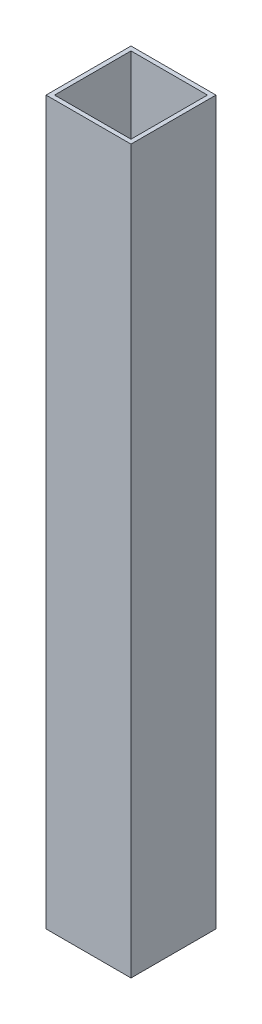
ISO-10303-21;
HEADER;
FILE_DESCRIPTION(('STEP AP214'),'2;1');
FILE_NAME('part.step','',(''),(''),'','','');
FILE_SCHEMA(('AUTOMOTIVE_DESIGN { 1 0 10303 214 1 1 1 1 }'));
ENDSEC;
DATA;
#1=APPLICATION_CONTEXT('core data for automotive mechanical design processes');
#2=APPLICATION_PROTOCOL_DEFINITION('international standard','automotive_design',2000,#1);
#3=PRODUCT_CONTEXT('',#1,'mechanical');
#4=PRODUCT('Part','Part','',(#3));
#5=PRODUCT_RELATED_PRODUCT_CATEGORY('part','',(#4));
#6=PRODUCT_DEFINITION_FORMATION('','',#4);
#7=PRODUCT_DEFINITION_CONTEXT('part definition',#1,'design');
#8=PRODUCT_DEFINITION('design','',#6,#7);
#9=PRODUCT_DEFINITION_SHAPE('','',#8);
#10=(LENGTH_UNIT() NAMED_UNIT(*) SI_UNIT(.MILLI.,.METRE.));
#11=(NAMED_UNIT(*) PLANE_ANGLE_UNIT() SI_UNIT($,.RADIAN.));
#12=(NAMED_UNIT(*) SI_UNIT($,.STERADIAN.) SOLID_ANGLE_UNIT());
#13=UNCERTAINTY_MEASURE_WITH_UNIT(LENGTH_MEASURE(1.E-05),#10,'distance_accuracy_value','');
#14=(GEOMETRIC_REPRESENTATION_CONTEXT(3) GLOBAL_UNCERTAINTY_ASSIGNED_CONTEXT((#13)) GLOBAL_UNIT_ASSIGNED_CONTEXT((#10,
#11,#12)) REPRESENTATION_CONTEXT('',''));
#15=CARTESIAN_POINT('',(0.,0.,0.));
#16=DIRECTION('',(0.,0.,1.));
#17=DIRECTION('',(1.,0.,0.));
#18=AXIS2_PLACEMENT_3D('',#15,#16,#17);
#19=CARTESIAN_POINT('',(0.,340.,0.));
#20=DIRECTION('',(0.,1.,0.));
#21=DIRECTION('',(0.,0.,1.));
#22=AXIS2_PLACEMENT_3D('',#19,#20,#21);
#23=PLANE('',#22);
#24=DIRECTION('',(0.,0.,-1.));
#25=VECTOR('',#24,1.);
#26=CARTESIAN_POINT('',(0.,340.,0.));
#27=LINE('',#26,#25);
#28=CARTESIAN_POINT('',(0.,340.,0.));
#29=VERTEX_POINT('',#28);
#30=CARTESIAN_POINT('',(0.,340.,-40.));
#31=VERTEX_POINT('',#30);
#32=EDGE_CURVE('E164',#29,#31,#27,.T.);
#33=ORIENTED_EDGE('',*,*,#32,.T.);
#34=DIRECTION('',(-1.,0.,0.));
#35=VECTOR('',#34,1.);
#36=CARTESIAN_POINT('',(0.,340.,-40.));
#37=LINE('',#36,#35);
#38=CARTESIAN_POINT('',(-40.,340.,-40.));
#39=VERTEX_POINT('',#38);
#40=EDGE_CURVE('E167',#31,#39,#37,.T.);
#41=ORIENTED_EDGE('',*,*,#40,.T.);
#42=DIRECTION('',(0.,0.,1.));
#43=VECTOR('',#42,1.);
#44=CARTESIAN_POINT('',(-40.,340.,0.));
#45=LINE('',#44,#43);
#46=CARTESIAN_POINT('',(-40.,340.,0.));
#47=VERTEX_POINT('',#46);
#48=EDGE_CURVE('E170',#39,#47,#45,.T.);
#49=ORIENTED_EDGE('',*,*,#48,.T.);
#50=DIRECTION('',(1.,0.,0.));
#51=VECTOR('',#50,1.);
#52=CARTESIAN_POINT('',(0.,340.,0.));
#53=LINE('',#52,#51);
#54=EDGE_CURVE('E172',#47,#29,#53,.T.);
#55=ORIENTED_EDGE('',*,*,#54,.T.);
#56=EDGE_LOOP('',(#33,#41,#49,#55));
#57=FACE_BOUND('',#56,.T.);
#58=DIRECTION('',(-1.,0.,0.));
#59=VECTOR('',#58,1.);
#60=CARTESIAN_POINT('',(0.,340.,-38.));
#61=LINE('',#60,#59);
#62=CARTESIAN_POINT('',(-2.,340.,-38.));
#63=VERTEX_POINT('',#62);
#64=CARTESIAN_POINT('',(-38.,340.,-38.));
#65=VERTEX_POINT('',#64);
#66=EDGE_CURVE('E136',#63,#65,#61,.T.);
#67=ORIENTED_EDGE('',*,*,#66,.F.);
#68=DIRECTION('',(0.,0.,-1.));
#69=VECTOR('',#68,1.);
#70=CARTESIAN_POINT('',(-2.,340.,0.));
#71=LINE('',#70,#69);
#72=CARTESIAN_POINT('',(-2.,340.,-2.));
#73=VERTEX_POINT('',#72);
#74=EDGE_CURVE('E128',#73,#63,#71,.T.);
#75=ORIENTED_EDGE('',*,*,#74,.F.);
#76=DIRECTION('',(1.,0.,0.));
#77=VECTOR('',#76,1.);
#78=CARTESIAN_POINT('',(0.,340.,-2.));
#79=LINE('',#78,#77);
#80=CARTESIAN_POINT('',(-38.,340.,-2.));
#81=VERTEX_POINT('',#80);
#82=EDGE_CURVE('E150',#81,#73,#79,.T.);
#83=ORIENTED_EDGE('',*,*,#82,.F.);
#84=DIRECTION('',(0.,0.,1.));
#85=VECTOR('',#84,1.);
#86=CARTESIAN_POINT('',(-38.,340.,0.));
#87=LINE('',#86,#85);
#88=EDGE_CURVE('E148',#65,#81,#87,.T.);
#89=ORIENTED_EDGE('',*,*,#88,.F.);
#90=EDGE_LOOP('',(#67,#75,#83,#89));
#91=FACE_BOUND('',#90,.T.);
#92=ADVANCED_FACE('F63',(#57,#91),#23,.T.);
#93=CARTESIAN_POINT('',(0.,0.,0.));
#94=DIRECTION('',(0.,1.,0.));
#95=DIRECTION('',(0.,0.,1.));
#96=AXIS2_PLACEMENT_3D('',#93,#94,#95);
#97=PLANE('',#96);
#98=DIRECTION('',(0.,0.,-1.));
#99=VECTOR('',#98,1.);
#100=CARTESIAN_POINT('',(0.,0.,0.));
#101=LINE('',#100,#99);
#102=CARTESIAN_POINT('',(0.,0.,0.));
#103=VERTEX_POINT('',#102);
#104=CARTESIAN_POINT('',(0.,0.,-40.));
#105=VERTEX_POINT('',#104);
#106=EDGE_CURVE('E144',#103,#105,#101,.T.);
#107=ORIENTED_EDGE('',*,*,#106,.F.);
#108=DIRECTION('',(1.,0.,0.));
#109=VECTOR('',#108,1.);
#110=CARTESIAN_POINT('',(0.,0.,0.));
#111=LINE('',#110,#109);
#112=CARTESIAN_POINT('',(-40.,0.,0.));
#113=VERTEX_POINT('',#112);
#114=EDGE_CURVE('E168',#113,#103,#111,.T.);
#115=ORIENTED_EDGE('',*,*,#114,.F.);
#116=DIRECTION('',(0.,0.,1.));
#117=VECTOR('',#116,1.);
#118=CARTESIAN_POINT('',(-40.,0.,0.));
#119=LINE('',#118,#117);
#120=CARTESIAN_POINT('',(-40.,0.,-40.));
#121=VERTEX_POINT('',#120);
#122=EDGE_CURVE('E179',#121,#113,#119,.T.);
#123=ORIENTED_EDGE('',*,*,#122,.F.);
#124=DIRECTION('',(-1.,0.,0.));
#125=VECTOR('',#124,1.);
#126=CARTESIAN_POINT('',(0.,0.,-40.));
#127=LINE('',#126,#125);
#128=EDGE_CURVE('E177',#105,#121,#127,.T.);
#129=ORIENTED_EDGE('',*,*,#128,.F.);
#130=EDGE_LOOP('',(#107,#115,#123,#129));
#131=FACE_BOUND('',#130,.T.);
#132=DIRECTION('',(0.,0.,-1.));
#133=VECTOR('',#132,1.);
#134=CARTESIAN_POINT('',(-2.,0.,0.));
#135=LINE('',#134,#133);
#136=CARTESIAN_POINT('',(-2.,0.,-2.));
#137=VERTEX_POINT('',#136);
#138=CARTESIAN_POINT('',(-2.,0.,-38.));
#139=VERTEX_POINT('',#138);
#140=EDGE_CURVE('E86',#137,#139,#135,.T.);
#141=ORIENTED_EDGE('',*,*,#140,.T.);
#142=DIRECTION('',(-1.,0.,0.));
#143=VECTOR('',#142,1.);
#144=CARTESIAN_POINT('',(0.,0.,-38.));
#145=LINE('',#144,#143);
#146=CARTESIAN_POINT('',(-38.,0.,-38.));
#147=VERTEX_POINT('',#146);
#148=EDGE_CURVE('E143',#139,#147,#145,.T.);
#149=ORIENTED_EDGE('',*,*,#148,.T.);
#150=DIRECTION('',(0.,0.,1.));
#151=VECTOR('',#150,1.);
#152=CARTESIAN_POINT('',(-38.,0.,0.));
#153=LINE('',#152,#151);
#154=CARTESIAN_POINT('',(-38.,0.,-2.));
#155=VERTEX_POINT('',#154);
#156=EDGE_CURVE('E156',#147,#155,#153,.T.);
#157=ORIENTED_EDGE('',*,*,#156,.T.);
#158=DIRECTION('',(1.,0.,0.));
#159=VECTOR('',#158,1.);
#160=CARTESIAN_POINT('',(0.,0.,-2.));
#161=LINE('',#160,#159);
#162=EDGE_CURVE('E137',#155,#137,#161,.T.);
#163=ORIENTED_EDGE('',*,*,#162,.T.);
#164=EDGE_LOOP('',(#141,#149,#157,#163));
#165=FACE_BOUND('',#164,.T.);
#166=ADVANCED_FACE('F197',(#131,#165),#97,.F.);
#167=CARTESIAN_POINT('',(0.,340.,0.));
#168=DIRECTION('',(-1.,0.,0.));
#169=DIRECTION('',(0.,0.,1.));
#170=AXIS2_PLACEMENT_3D('',#167,#168,#169);
#171=PLANE('',#170);
#172=ORIENTED_EDGE('',*,*,#106,.T.);
#173=DIRECTION('',(0.,-1.,0.));
#174=VECTOR('',#173,1.);
#175=CARTESIAN_POINT('',(0.,340.,-40.));
#176=LINE('',#175,#174);
#177=EDGE_CURVE('E12',#31,#105,#176,.T.);
#178=ORIENTED_EDGE('',*,*,#177,.F.);
#179=ORIENTED_EDGE('',*,*,#32,.F.);
#180=DIRECTION('',(0.,-1.,0.));
#181=VECTOR('',#180,1.);
#182=CARTESIAN_POINT('',(0.,340.,0.));
#183=LINE('',#182,#181);
#184=EDGE_CURVE('E174',#29,#103,#183,.T.);
#185=ORIENTED_EDGE('',*,*,#184,.T.);
#186=EDGE_LOOP('',(#172,#178,#179,#185));
#187=FACE_BOUND('',#186,.T.);
#188=ADVANCED_FACE('F65',(#187),#171,.F.);
#189=CARTESIAN_POINT('',(0.,340.,-40.));
#190=DIRECTION('',(0.,0.,1.));
#191=DIRECTION('',(1.,0.,0.));
#192=AXIS2_PLACEMENT_3D('',#189,#190,#191);
#193=PLANE('',#192);
#194=ORIENTED_EDGE('',*,*,#128,.T.);
#195=DIRECTION('',(0.,-1.,0.));
#196=VECTOR('',#195,1.);
#197=CARTESIAN_POINT('',(-40.,340.,-40.));
#198=LINE('',#197,#196);
#199=EDGE_CURVE('E71',#39,#121,#198,.T.);
#200=ORIENTED_EDGE('',*,*,#199,.F.);
#201=ORIENTED_EDGE('',*,*,#40,.F.);
#202=ORIENTED_EDGE('',*,*,#177,.T.);
#203=EDGE_LOOP('',(#194,#200,#201,#202));
#204=FACE_BOUND('',#203,.T.);
#205=ADVANCED_FACE('F207',(#204),#193,.F.);
#206=CARTESIAN_POINT('',(-40.,340.,0.));
#207=DIRECTION('',(1.,0.,0.));
#208=DIRECTION('',(0.,0.,-1.));
#209=AXIS2_PLACEMENT_3D('',#206,#207,#208);
#210=PLANE('',#209);
#211=ORIENTED_EDGE('',*,*,#122,.T.);
#212=DIRECTION('',(0.,-1.,0.));
#213=VECTOR('',#212,1.);
#214=CARTESIAN_POINT('',(-40.,340.,0.));
#215=LINE('',#214,#213);
#216=EDGE_CURVE('E184',#47,#113,#215,.T.);
#217=ORIENTED_EDGE('',*,*,#216,.F.);
#218=ORIENTED_EDGE('',*,*,#48,.F.);
#219=ORIENTED_EDGE('',*,*,#199,.T.);
#220=EDGE_LOOP('',(#211,#217,#218,#219));
#221=FACE_BOUND('',#220,.T.);
#222=ADVANCED_FACE('F191',(#221),#210,.F.);
#223=CARTESIAN_POINT('',(0.,340.,0.));
#224=DIRECTION('',(0.,0.,-1.));
#225=DIRECTION('',(-1.,0.,0.));
#226=AXIS2_PLACEMENT_3D('',#223,#224,#225);
#227=PLANE('',#226);
#228=ORIENTED_EDGE('',*,*,#114,.T.);
#229=ORIENTED_EDGE('',*,*,#184,.F.);
#230=ORIENTED_EDGE('',*,*,#54,.F.);
#231=ORIENTED_EDGE('',*,*,#216,.T.);
#232=EDGE_LOOP('',(#228,#229,#230,#231));
#233=FACE_BOUND('',#232,.T.);
#234=ADVANCED_FACE('F201',(#233),#227,.F.);
#235=CARTESIAN_POINT('',(-2.,340.,0.));
#236=DIRECTION('',(-1.,0.,0.));
#237=DIRECTION('',(0.,0.,1.));
#238=AXIS2_PLACEMENT_3D('',#235,#236,#237);
#239=PLANE('',#238);
#240=ORIENTED_EDGE('',*,*,#140,.F.);
#241=DIRECTION('',(0.,-1.,0.));
#242=VECTOR('',#241,1.);
#243=CARTESIAN_POINT('',(-2.,340.,-2.));
#244=LINE('',#243,#242);
#245=EDGE_CURVE('E132',#73,#137,#244,.T.);
#246=ORIENTED_EDGE('',*,*,#245,.F.);
#247=ORIENTED_EDGE('',*,*,#74,.T.);
#248=DIRECTION('',(0.,-1.,0.));
#249=VECTOR('',#248,1.);
#250=CARTESIAN_POINT('',(-2.,340.,-38.));
#251=LINE('',#250,#249);
#252=EDGE_CURVE('E131',#63,#139,#251,.T.);
#253=ORIENTED_EDGE('',*,*,#252,.T.);
#254=EDGE_LOOP('',(#240,#246,#247,#253));
#255=FACE_BOUND('',#254,.T.);
#256=ADVANCED_FACE('F130',(#255),#239,.T.);
#257=CARTESIAN_POINT('',(0.,340.,-38.));
#258=DIRECTION('',(0.,0.,1.));
#259=DIRECTION('',(1.,0.,0.));
#260=AXIS2_PLACEMENT_3D('',#257,#258,#259);
#261=PLANE('',#260);
#262=ORIENTED_EDGE('',*,*,#148,.F.);
#263=ORIENTED_EDGE('',*,*,#252,.F.);
#264=ORIENTED_EDGE('',*,*,#66,.T.);
#265=DIRECTION('',(0.,-1.,0.));
#266=VECTOR('',#265,1.);
#267=CARTESIAN_POINT('',(-38.,340.,-38.));
#268=LINE('',#267,#266);
#269=EDGE_CURVE('E145',#65,#147,#268,.T.);
#270=ORIENTED_EDGE('',*,*,#269,.T.);
#271=EDGE_LOOP('',(#262,#263,#264,#270));
#272=FACE_BOUND('',#271,.T.);
#273=ADVANCED_FACE('F140',(#272),#261,.T.);
#274=CARTESIAN_POINT('',(-38.,340.,0.));
#275=DIRECTION('',(1.,0.,0.));
#276=DIRECTION('',(0.,0.,-1.));
#277=AXIS2_PLACEMENT_3D('',#274,#275,#276);
#278=PLANE('',#277);
#279=ORIENTED_EDGE('',*,*,#156,.F.);
#280=ORIENTED_EDGE('',*,*,#269,.F.);
#281=ORIENTED_EDGE('',*,*,#88,.T.);
#282=DIRECTION('',(0.,-1.,0.));
#283=VECTOR('',#282,1.);
#284=CARTESIAN_POINT('',(-38.,340.,-2.));
#285=LINE('',#284,#283);
#286=EDGE_CURVE('E78',#81,#155,#285,.T.);
#287=ORIENTED_EDGE('',*,*,#286,.T.);
#288=EDGE_LOOP('',(#279,#280,#281,#287));
#289=FACE_BOUND('',#288,.T.);
#290=ADVANCED_FACE('F230',(#289),#278,.T.);
#291=CARTESIAN_POINT('',(0.,340.,-2.));
#292=DIRECTION('',(0.,0.,-1.));
#293=DIRECTION('',(-1.,0.,0.));
#294=AXIS2_PLACEMENT_3D('',#291,#292,#293);
#295=PLANE('',#294);
#296=ORIENTED_EDGE('',*,*,#162,.F.);
#297=ORIENTED_EDGE('',*,*,#286,.F.);
#298=ORIENTED_EDGE('',*,*,#82,.T.);
#299=ORIENTED_EDGE('',*,*,#245,.T.);
#300=EDGE_LOOP('',(#296,#297,#298,#299));
#301=FACE_BOUND('',#300,.T.);
#302=ADVANCED_FACE('F234',(#301),#295,.T.);
#303=CLOSED_SHELL('',(#92,#166,#188,#205,#222,#234,#256,#273,#290,#302));
#304=MANIFOLD_SOLID_BREP('B2',#303);
#305=ADVANCED_BREP_SHAPE_REPRESENTATION('',(#18,#304),#14);
#306=SHAPE_DEFINITION_REPRESENTATION(#9,#305);
ENDSEC;
END-ISO-10303-21;
